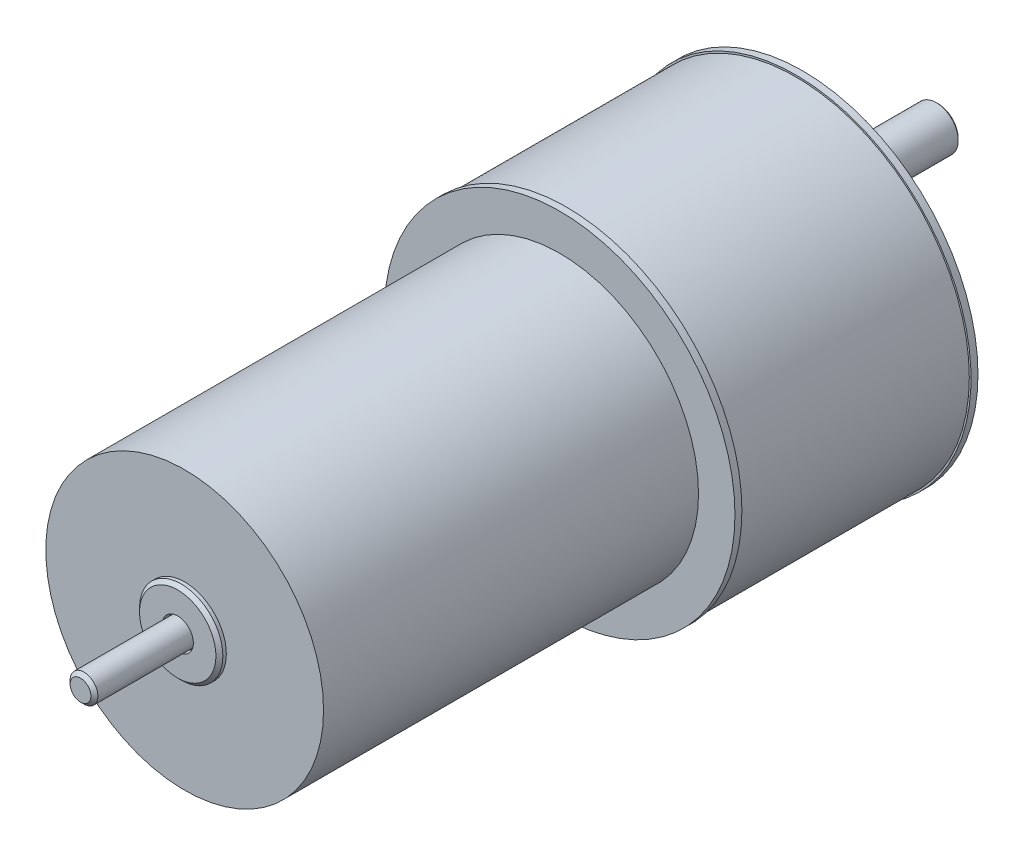
ISO-10303-21;
HEADER;
FILE_DESCRIPTION(('STEP AP214'),'2;1');
FILE_NAME('part.step','',(''),(''),'','','');
FILE_SCHEMA(('AUTOMOTIVE_DESIGN { 1 0 10303 214 1 1 1 1 }'));
ENDSEC;
DATA;
#1=APPLICATION_CONTEXT('core data for automotive mechanical design processes');
#2=APPLICATION_PROTOCOL_DEFINITION('international standard','automotive_design',2000,#1);
#3=PRODUCT_CONTEXT('',#1,'mechanical');
#4=PRODUCT('Part','Part','',(#3));
#5=PRODUCT_RELATED_PRODUCT_CATEGORY('part','',(#4));
#6=PRODUCT_DEFINITION_FORMATION('','',#4);
#7=PRODUCT_DEFINITION_CONTEXT('part definition',#1,'design');
#8=PRODUCT_DEFINITION('design','',#6,#7);
#9=PRODUCT_DEFINITION_SHAPE('','',#8);
#10=(LENGTH_UNIT() NAMED_UNIT(*) SI_UNIT(.MILLI.,.METRE.));
#11=(NAMED_UNIT(*) PLANE_ANGLE_UNIT() SI_UNIT($,.RADIAN.));
#12=(NAMED_UNIT(*) SI_UNIT($,.STERADIAN.) SOLID_ANGLE_UNIT());
#13=UNCERTAINTY_MEASURE_WITH_UNIT(LENGTH_MEASURE(1.E-05),#10,'distance_accuracy_value','');
#14=(GEOMETRIC_REPRESENTATION_CONTEXT(3) GLOBAL_UNCERTAINTY_ASSIGNED_CONTEXT((#13)) GLOBAL_UNIT_ASSIGNED_CONTEXT((#10,
#11,#12)) REPRESENTATION_CONTEXT('',''));
#15=CARTESIAN_POINT('',(0.,0.,0.));
#16=DIRECTION('',(0.,0.,1.));
#17=DIRECTION('',(1.,0.,0.));
#18=AXIS2_PLACEMENT_3D('',#15,#16,#17);
#19=CARTESIAN_POINT('',(0.,0.,35.));
#20=DIRECTION('',(0.,0.,-1.));
#21=DIRECTION('',(-1.,0.,0.));
#22=AXIS2_PLACEMENT_3D('',#19,#20,#21);
#23=CYLINDRICAL_SURFACE('',#22,25.25);
#24=CARTESIAN_POINT('',(0.,0.,34.));
#25=DIRECTION('',(0.,0.,1.));
#26=DIRECTION('',(1.,0.,0.));
#27=AXIS2_PLACEMENT_3D('',#24,#25,#26);
#28=CIRCLE('',#27,25.25);
#29=CARTESIAN_POINT('',(25.25,0.,34.));
#30=VERTEX_POINT('',#29);
#31=EDGE_CURVE('E40',#30,#30,#28,.T.);
#32=ORIENTED_EDGE('',*,*,#31,.T.);
#33=EDGE_LOOP('',(#32));
#34=FACE_BOUND('',#33,.T.);
#35=CARTESIAN_POINT('',(0.,0.,35.));
#36=DIRECTION('',(0.,0.,1.));
#37=DIRECTION('',(1.,0.,0.));
#38=AXIS2_PLACEMENT_3D('',#35,#36,#37);
#39=CIRCLE('',#38,25.25);
#40=CARTESIAN_POINT('',(25.25,0.,35.));
#41=VERTEX_POINT('',#40);
#42=EDGE_CURVE('E85',#41,#41,#39,.T.);
#43=ORIENTED_EDGE('',*,*,#42,.F.);
#44=EDGE_LOOP('',(#43));
#45=FACE_BOUND('',#44,.T.);
#46=ADVANCED_FACE('F36',(#34,#45),#23,.T.);
#47=CARTESIAN_POINT('',(0.,0.,89.));
#48=DIRECTION('',(0.,0.,1.));
#49=DIRECTION('',(1.,0.,0.));
#50=AXIS2_PLACEMENT_3D('',#47,#48,#49);
#51=PLANE('',#50);
#52=CARTESIAN_POINT('',(0.,0.,89.));
#53=DIRECTION('',(0.,0.,1.));
#54=DIRECTION('',(1.,0.,0.));
#55=AXIS2_PLACEMENT_3D('',#52,#53,#54);
#56=CIRCLE('',#55,20.);
#57=CARTESIAN_POINT('',(20.,0.,89.));
#58=VERTEX_POINT('',#57);
#59=EDGE_CURVE('E79',#58,#58,#56,.T.);
#60=ORIENTED_EDGE('',*,*,#59,.T.);
#61=EDGE_LOOP('',(#60));
#62=FACE_BOUND('',#61,.T.);
#63=CARTESIAN_POINT('',(0.,0.,89.));
#64=DIRECTION('',(0.,0.,1.));
#65=DIRECTION('',(1.,0.,0.));
#66=AXIS2_PLACEMENT_3D('',#63,#64,#65);
#67=CIRCLE('',#66,6.);
#68=CARTESIAN_POINT('',(6.,0.,89.));
#69=VERTEX_POINT('',#68);
#70=EDGE_CURVE('E126',#69,#69,#67,.T.);
#71=ORIENTED_EDGE('',*,*,#70,.F.);
#72=EDGE_LOOP('',(#71));
#73=FACE_BOUND('',#72,.T.);
#74=ADVANCED_FACE('F150',(#62,#73),#51,.T.);
#75=CARTESIAN_POINT('',(0.,0.,35.));
#76=DIRECTION('',(0.,0.,1.));
#77=DIRECTION('',(1.,0.,0.));
#78=AXIS2_PLACEMENT_3D('',#75,#76,#77);
#79=PLANE('',#78);
#80=ORIENTED_EDGE('',*,*,#42,.T.);
#81=EDGE_LOOP('',(#80));
#82=FACE_BOUND('',#81,.T.);
#83=CARTESIAN_POINT('',(0.,0.,35.));
#84=DIRECTION('',(0.,0.,1.));
#85=DIRECTION('',(1.,0.,0.));
#86=AXIS2_PLACEMENT_3D('',#83,#84,#85);
#87=CIRCLE('',#86,20.);
#88=CARTESIAN_POINT('',(20.,0.,35.));
#89=VERTEX_POINT('',#88);
#90=EDGE_CURVE('E78',#89,#89,#87,.T.);
#91=ORIENTED_EDGE('',*,*,#90,.F.);
#92=EDGE_LOOP('',(#91));
#93=FACE_BOUND('',#92,.T.);
#94=ADVANCED_FACE('F157',(#82,#93),#79,.T.);
#95=CARTESIAN_POINT('',(0.,0.,89.));
#96=DIRECTION('',(0.,0.,-1.));
#97=DIRECTION('',(-1.,0.,0.));
#98=AXIS2_PLACEMENT_3D('',#95,#96,#97);
#99=CYLINDRICAL_SURFACE('',#98,20.);
#100=ORIENTED_EDGE('',*,*,#59,.F.);
#101=EDGE_LOOP('',(#100));
#102=FACE_BOUND('',#101,.T.);
#103=ORIENTED_EDGE('',*,*,#90,.T.);
#104=EDGE_LOOP('',(#103));
#105=FACE_BOUND('',#104,.T.);
#106=ADVANCED_FACE('F190',(#102,#105),#99,.T.);
#107=CARTESIAN_POINT('',(0.,0.,90.));
#108=DIRECTION('',(0.,0.,1.));
#109=DIRECTION('',(1.,0.,0.));
#110=AXIS2_PLACEMENT_3D('',#107,#108,#109);
#111=PLANE('',#110);
#112=CARTESIAN_POINT('',(0.,0.,90.));
#113=DIRECTION('',(0.,0.,1.));
#114=DIRECTION('',(1.,0.,0.));
#115=AXIS2_PLACEMENT_3D('',#112,#113,#114);
#116=CIRCLE('',#115,5.50000000000002);
#117=CARTESIAN_POINT('',(5.50000000000002,0.,90.));
#118=VERTEX_POINT('',#117);
#119=EDGE_CURVE('E45',#118,#118,#116,.T.);
#120=ORIENTED_EDGE('',*,*,#119,.T.);
#121=EDGE_LOOP('',(#120));
#122=FACE_BOUND('',#121,.T.);
#123=CARTESIAN_POINT('',(0.,0.,90.));
#124=DIRECTION('',(0.,0.,1.));
#125=DIRECTION('',(1.,0.,0.));
#126=AXIS2_PLACEMENT_3D('',#123,#124,#125);
#127=CIRCLE('',#126,2.25);
#128=CARTESIAN_POINT('',(2.25,0.,90.));
#129=VERTEX_POINT('',#128);
#130=EDGE_CURVE('E115',#129,#129,#127,.T.);
#131=ORIENTED_EDGE('',*,*,#130,.F.);
#132=EDGE_LOOP('',(#131));
#133=FACE_BOUND('',#132,.T.);
#134=ADVANCED_FACE('F193',(#122,#133),#111,.T.);
#135=CARTESIAN_POINT('',(0.,0.,90.));
#136=DIRECTION('',(0.,0.,-1.));
#137=DIRECTION('',(-1.,0.,0.));
#138=AXIS2_PLACEMENT_3D('',#135,#136,#137);
#139=CYLINDRICAL_SURFACE('',#138,6.);
#140=CARTESIAN_POINT('',(0.,0.,89.5));
#141=DIRECTION('',(0.,0.,1.));
#142=DIRECTION('',(1.,0.,0.));
#143=AXIS2_PLACEMENT_3D('',#140,#141,#142);
#144=CIRCLE('',#143,6.);
#145=CARTESIAN_POINT('',(6.,0.,89.5));
#146=VERTEX_POINT('',#145);
#147=EDGE_CURVE('E11',#146,#146,#144,.F.);
#148=ORIENTED_EDGE('',*,*,#147,.T.);
#149=EDGE_LOOP('',(#148));
#150=FACE_BOUND('',#149,.T.);
#151=ORIENTED_EDGE('',*,*,#70,.T.);
#152=EDGE_LOOP('',(#151));
#153=FACE_BOUND('',#152,.T.);
#154=ADVANCED_FACE('F215',(#150,#153),#139,.T.);
#155=CARTESIAN_POINT('',(0.,0.,90.));
#156=DIRECTION('',(0.,0.,-1.));
#157=DIRECTION('',(-1.,0.,0.));
#158=AXIS2_PLACEMENT_3D('',#155,#156,#157);
#159=CYLINDRICAL_SURFACE('',#158,2.25);
#160=ORIENTED_EDGE('',*,*,#130,.T.);
#161=EDGE_LOOP('',(#160));
#162=FACE_BOUND('',#161,.T.);
#163=CARTESIAN_POINT('',(0.,0.,89.));
#164=DIRECTION('',(0.,0.,1.));
#165=DIRECTION('',(1.,0.,0.));
#166=AXIS2_PLACEMENT_3D('',#163,#164,#165);
#167=CIRCLE('',#166,2.25);
#168=CARTESIAN_POINT('',(2.25,0.,89.));
#169=VERTEX_POINT('',#168);
#170=EDGE_CURVE('E105',#169,#169,#167,.F.);
#171=ORIENTED_EDGE('',*,*,#170,.T.);
#172=EDGE_LOOP('',(#171));
#173=FACE_BOUND('',#172,.T.);
#174=ADVANCED_FACE('F224',(#162,#173),#159,.F.);
#175=CARTESIAN_POINT('',(0.,0.,104.));
#176=DIRECTION('',(0.,0.,1.));
#177=DIRECTION('',(1.,0.,0.));
#178=AXIS2_PLACEMENT_3D('',#175,#176,#177);
#179=PLANE('',#178);
#180=CARTESIAN_POINT('',(0.,0.,104.));
#181=DIRECTION('',(0.,0.,1.));
#182=DIRECTION('',(1.,0.,0.));
#183=AXIS2_PLACEMENT_3D('',#180,#181,#182);
#184=CIRCLE('',#183,1.49999999999997);
#185=CARTESIAN_POINT('',(1.49999999999997,0.,104.));
#186=VERTEX_POINT('',#185);
#187=EDGE_CURVE('E99',#186,#186,#184,.T.);
#188=ORIENTED_EDGE('',*,*,#187,.T.);
#189=EDGE_LOOP('',(#188));
#190=FACE_BOUND('',#189,.T.);
#191=ADVANCED_FACE('F233',(#190),#179,.T.);
#192=CARTESIAN_POINT('',(0.,0.,104.));
#193=DIRECTION('',(0.,0.,-1.));
#194=DIRECTION('',(-1.,0.,0.));
#195=AXIS2_PLACEMENT_3D('',#192,#193,#194);
#196=CONICAL_SURFACE('',#195,1.49999999999997,0.78539816339746);
#197=CARTESIAN_POINT('',(0.,0.,103.5));
#198=DIRECTION('',(0.,0.,1.));
#199=DIRECTION('',(1.,0.,0.));
#200=AXIS2_PLACEMENT_3D('',#197,#198,#199);
#201=CIRCLE('',#200,2.);
#202=CARTESIAN_POINT('',(2.,0.,103.5));
#203=VERTEX_POINT('',#202);
#204=EDGE_CURVE('E102',#203,#203,#201,.F.);
#205=ORIENTED_EDGE('',*,*,#204,.F.);
#206=EDGE_LOOP('',(#205));
#207=FACE_BOUND('',#206,.T.);
#208=ORIENTED_EDGE('',*,*,#187,.F.);
#209=EDGE_LOOP('',(#208));
#210=FACE_BOUND('',#209,.T.);
#211=ADVANCED_FACE('F241',(#207,#210),#196,.T.);
#212=CARTESIAN_POINT('',(0.,0.,104.));
#213=DIRECTION('',(0.,0.,-1.));
#214=DIRECTION('',(-1.,0.,0.));
#215=AXIS2_PLACEMENT_3D('',#212,#213,#214);
#216=CYLINDRICAL_SURFACE('',#215,2.);
#217=ORIENTED_EDGE('',*,*,#204,.T.);
#218=EDGE_LOOP('',(#217));
#219=FACE_BOUND('',#218,.T.);
#220=CARTESIAN_POINT('',(0.,0.,89.));
#221=DIRECTION('',(0.,0.,1.));
#222=DIRECTION('',(1.,0.,0.));
#223=AXIS2_PLACEMENT_3D('',#220,#221,#222);
#224=CIRCLE('',#223,2.);
#225=CARTESIAN_POINT('',(2.,0.,89.));
#226=VERTEX_POINT('',#225);
#227=EDGE_CURVE('E129',#226,#226,#224,.T.);
#228=ORIENTED_EDGE('',*,*,#227,.T.);
#229=EDGE_LOOP('',(#228));
#230=FACE_BOUND('',#229,.T.);
#231=ADVANCED_FACE('F188',(#219,#230),#216,.T.);
#232=ORIENTED_EDGE('',*,*,#170,.F.);
#233=EDGE_LOOP('',(#232));
#234=FACE_BOUND('',#233,.T.);
#235=ORIENTED_EDGE('',*,*,#227,.F.);
#236=EDGE_LOOP('',(#235));
#237=FACE_BOUND('',#236,.T.);
#238=ADVANCED_FACE('F160',(#234,#237),#51,.T.);
#239=CARTESIAN_POINT('',(0.,0.,90.));
#240=DIRECTION('',(0.,0.,-1.));
#241=DIRECTION('',(-1.,0.,0.));
#242=AXIS2_PLACEMENT_3D('',#239,#240,#241);
#243=CONICAL_SURFACE('',#242,5.50000000000002,0.785398163397444);
#244=ORIENTED_EDGE('',*,*,#147,.F.);
#245=EDGE_LOOP('',(#244));
#246=FACE_BOUND('',#245,.T.);
#247=ORIENTED_EDGE('',*,*,#119,.F.);
#248=EDGE_LOOP('',(#247));
#249=FACE_BOUND('',#248,.T.);
#250=ADVANCED_FACE('F38',(#246,#249),#243,.T.);
#251=CARTESIAN_POINT('',(0.,40.5404466934338,34.));
#252=DIRECTION('',(0.,0.,1.));
#253=DIRECTION('',(1.,0.,0.));
#254=AXIS2_PLACEMENT_3D('',#251,#252,#253);
#255=PLANE('',#254);
#256=CARTESIAN_POINT('',(0.,0.,34.));
#257=DIRECTION('',(0.,0.,-1.));
#258=DIRECTION('',(-1.,0.,0.));
#259=AXIS2_PLACEMENT_3D('',#256,#257,#258);
#260=CIRCLE('',#259,25.);
#261=CARTESIAN_POINT('',(-25.,0.,34.));
#262=VERTEX_POINT('',#261);
#263=EDGE_CURVE('E117',#262,#262,#260,.T.);
#264=ORIENTED_EDGE('',*,*,#263,.F.);
#265=EDGE_LOOP('',(#264));
#266=FACE_BOUND('',#265,.T.);
#267=ORIENTED_EDGE('',*,*,#31,.F.);
#268=EDGE_LOOP('',(#267));
#269=FACE_BOUND('',#268,.T.);
#270=ADVANCED_FACE('F265',(#266,#269),#255,.F.);
#271=CARTESIAN_POINT('',(0.,40.5404466934338,0.999999999999988));
#272=DIRECTION('',(0.,0.,-1.));
#273=DIRECTION('',(-1.,0.,0.));
#274=AXIS2_PLACEMENT_3D('',#271,#272,#273);
#275=PLANE('',#274);
#276=CARTESIAN_POINT('',(0.,0.,0.999999999999987));
#277=DIRECTION('',(0.,0.,-1.));
#278=DIRECTION('',(-1.,0.,0.));
#279=AXIS2_PLACEMENT_3D('',#276,#277,#278);
#280=CIRCLE('',#279,25.);
#281=CARTESIAN_POINT('',(-25.,0.,0.999999999999987));
#282=VERTEX_POINT('',#281);
#283=EDGE_CURVE('E111',#282,#282,#280,.T.);
#284=ORIENTED_EDGE('',*,*,#283,.T.);
#285=EDGE_LOOP('',(#284));
#286=FACE_BOUND('',#285,.T.);
#287=CARTESIAN_POINT('',(0.,0.,0.999999999999987));
#288=DIRECTION('',(0.,0.,-1.));
#289=DIRECTION('',(-1.,0.,0.));
#290=AXIS2_PLACEMENT_3D('',#287,#288,#289);
#291=CIRCLE('',#290,25.25);
#292=CARTESIAN_POINT('',(-25.25,0.,0.999999999999987));
#293=VERTEX_POINT('',#292);
#294=EDGE_CURVE('E109',#293,#293,#291,.T.);
#295=ORIENTED_EDGE('',*,*,#294,.F.);
#296=EDGE_LOOP('',(#295));
#297=FACE_BOUND('',#296,.T.);
#298=ADVANCED_FACE('F272',(#286,#297),#275,.F.);
#299=CARTESIAN_POINT('',(0.,0.,0.));
#300=DIRECTION('',(0.,0.,-1.));
#301=DIRECTION('',(-1.,0.,0.));
#302=AXIS2_PLACEMENT_3D('',#299,#300,#301);
#303=CYLINDRICAL_SURFACE('',#302,25.);
#304=ORIENTED_EDGE('',*,*,#283,.F.);
#305=EDGE_LOOP('',(#304));
#306=FACE_BOUND('',#305,.T.);
#307=ORIENTED_EDGE('',*,*,#263,.T.);
#308=EDGE_LOOP('',(#307));
#309=FACE_BOUND('',#308,.T.);
#310=ADVANCED_FACE('F280',(#306,#309),#303,.T.);
#311=CARTESIAN_POINT('',(0.,8.5,-19.5));
#312=DIRECTION('',(0.,0.,-1.));
#313=DIRECTION('',(-1.,0.,0.));
#314=AXIS2_PLACEMENT_3D('',#311,#312,#313);
#315=PLANE('',#314);
#316=CARTESIAN_POINT('',(0.,8.5,-19.5));
#317=DIRECTION('',(0.,0.,-1.));
#318=DIRECTION('',(-1.,0.,0.));
#319=AXIS2_PLACEMENT_3D('',#316,#317,#318);
#320=CIRCLE('',#319,2.89999999999999);
#321=CARTESIAN_POINT('',(-2.89999999999999,8.5,-19.5));
#322=VERTEX_POINT('',#321);
#323=EDGE_CURVE('E93',#322,#322,#320,.T.);
#324=ORIENTED_EDGE('',*,*,#323,.T.);
#325=EDGE_LOOP('',(#324));
#326=FACE_BOUND('',#325,.T.);
#327=ADVANCED_FACE('F287',(#326),#315,.T.);
#328=CARTESIAN_POINT('',(0.,8.5,-19.5));
#329=DIRECTION('',(0.,0.,1.));
#330=DIRECTION('',(1.,0.,0.));
#331=AXIS2_PLACEMENT_3D('',#328,#329,#330);
#332=CONICAL_SURFACE('',#331,2.89999999999999,0.785398163397456);
#333=CARTESIAN_POINT('',(0.,8.5,-19.25));
#334=DIRECTION('',(0.,0.,-1.));
#335=DIRECTION('',(-1.,0.,0.));
#336=AXIS2_PLACEMENT_3D('',#333,#334,#335);
#337=CIRCLE('',#336,3.15);
#338=CARTESIAN_POINT('',(-3.15,8.5,-19.25));
#339=VERTEX_POINT('',#338);
#340=EDGE_CURVE('E96',#339,#339,#337,.F.);
#341=ORIENTED_EDGE('',*,*,#340,.F.);
#342=EDGE_LOOP('',(#341));
#343=FACE_BOUND('',#342,.T.);
#344=ORIENTED_EDGE('',*,*,#323,.F.);
#345=EDGE_LOOP('',(#344));
#346=FACE_BOUND('',#345,.T.);
#347=ADVANCED_FACE('F145',(#343,#346),#332,.T.);
#348=CARTESIAN_POINT('',(0.,8.5,-19.5));
#349=DIRECTION('',(0.,0.,1.));
#350=DIRECTION('',(1.,0.,0.));
#351=AXIS2_PLACEMENT_3D('',#348,#349,#350);
#352=CYLINDRICAL_SURFACE('',#351,3.15);
#353=ORIENTED_EDGE('',*,*,#340,.T.);
#354=EDGE_LOOP('',(#353));
#355=FACE_BOUND('',#354,.T.);
#356=CARTESIAN_POINT('',(0.,8.5,-1.5));
#357=DIRECTION('',(0.,0.,-1.));
#358=DIRECTION('',(-1.,0.,0.));
#359=AXIS2_PLACEMENT_3D('',#356,#357,#358);
#360=CIRCLE('',#359,3.15);
#361=CARTESIAN_POINT('',(-3.15,8.5,-1.5));
#362=VERTEX_POINT('',#361);
#363=EDGE_CURVE('E69',#362,#362,#360,.T.);
#364=ORIENTED_EDGE('',*,*,#363,.T.);
#365=EDGE_LOOP('',(#364));
#366=FACE_BOUND('',#365,.T.);
#367=ADVANCED_FACE('F134',(#355,#366),#352,.T.);
#368=CARTESIAN_POINT('',(0.,0.,-1.5));
#369=DIRECTION('',(0.,0.,-1.));
#370=DIRECTION('',(-1.,0.,0.));
#371=AXIS2_PLACEMENT_3D('',#368,#369,#370);
#372=PLANE('',#371);
#373=CARTESIAN_POINT('',(0.,0.,-1.5));
#374=DIRECTION('',(0.,0.,-1.));
#375=DIRECTION('',(-1.,0.,0.));
#376=AXIS2_PLACEMENT_3D('',#373,#374,#375);
#377=CIRCLE('',#376,14.25);
#378=CARTESIAN_POINT('',(-14.25,0.,-1.5));
#379=VERTEX_POINT('',#378);
#380=EDGE_CURVE('E75',#379,#379,#377,.T.);
#381=ORIENTED_EDGE('',*,*,#380,.T.);
#382=EDGE_LOOP('',(#381));
#383=FACE_BOUND('',#382,.T.);
#384=ORIENTED_EDGE('',*,*,#363,.F.);
#385=EDGE_LOOP('',(#384));
#386=FACE_BOUND('',#385,.T.);
#387=ADVANCED_FACE('F136',(#383,#386),#372,.T.);
#388=CARTESIAN_POINT('',(-19.,0.,11.5));
#389=DIRECTION('',(0.,0.,-1.));
#390=DIRECTION('',(-1.,0.,0.));
#391=AXIS2_PLACEMENT_3D('',#388,#389,#390);
#392=CONICAL_SURFACE('',#391,1.65,1.02974425867665);
#393=CARTESIAN_POINT('',(-19.,0.,12.4914200213955));
#394=VERTEX_POINT('',#393);
#395=VERTEX_LOOP('',#394);
#396=FACE_BOUND('',#395,.T.);
#397=CARTESIAN_POINT('',(-19.,0.,11.5));
#398=DIRECTION('',(0.,0.,-1.));
#399=DIRECTION('',(-1.,0.,0.));
#400=AXIS2_PLACEMENT_3D('',#397,#398,#399);
#401=CIRCLE('',#400,1.65);
#402=CARTESIAN_POINT('',(-20.65,0.,11.5));
#403=VERTEX_POINT('',#402);
#404=EDGE_CURVE('E66',#403,#403,#401,.T.);
#405=ORIENTED_EDGE('',*,*,#404,.T.);
#406=EDGE_LOOP('',(#405));
#407=FACE_BOUND('',#406,.T.);
#408=ADVANCED_FACE('F56',(#396,#407),#392,.F.);
#409=CARTESIAN_POINT('',(19.,0.,11.5));
#410=DIRECTION('',(0.,0.,-1.));
#411=DIRECTION('',(-1.,0.,0.));
#412=AXIS2_PLACEMENT_3D('',#409,#410,#411);
#413=CONICAL_SURFACE('',#412,1.65,1.02974425867665);
#414=CARTESIAN_POINT('',(19.,0.,12.4914200213955));
#415=VERTEX_POINT('',#414);
#416=VERTEX_LOOP('',#415);
#417=FACE_BOUND('',#416,.T.);
#418=CARTESIAN_POINT('',(19.,0.,11.5));
#419=DIRECTION('',(0.,0.,-1.));
#420=DIRECTION('',(-1.,0.,0.));
#421=AXIS2_PLACEMENT_3D('',#418,#419,#420);
#422=CIRCLE('',#421,1.65);
#423=CARTESIAN_POINT('',(17.35,0.,11.5));
#424=VERTEX_POINT('',#423);
#425=EDGE_CURVE('E60',#424,#424,#422,.T.);
#426=ORIENTED_EDGE('',*,*,#425,.T.);
#427=EDGE_LOOP('',(#426));
#428=FACE_BOUND('',#427,.T.);
#429=ADVANCED_FACE('F52',(#417,#428),#413,.F.);
#430=CARTESIAN_POINT('',(0.,0.,-1.5));
#431=DIRECTION('',(0.,0.,1.));
#432=DIRECTION('',(1.,0.,0.));
#433=AXIS2_PLACEMENT_3D('',#430,#431,#432);
#434=CYLINDRICAL_SURFACE('',#433,14.25);
#435=ORIENTED_EDGE('',*,*,#380,.F.);
#436=EDGE_LOOP('',(#435));
#437=FACE_BOUND('',#436,.T.);
#438=CARTESIAN_POINT('',(0.,0.,0.));
#439=DIRECTION('',(0.,0.,1.));
#440=DIRECTION('',(1.,0.,0.));
#441=AXIS2_PLACEMENT_3D('',#438,#439,#440);
#442=CIRCLE('',#441,14.25);
#443=CARTESIAN_POINT('',(14.25,0.,0.));
#444=VERTEX_POINT('',#443);
#445=EDGE_CURVE('E88',#444,#444,#442,.F.);
#446=ORIENTED_EDGE('',*,*,#445,.T.);
#447=EDGE_LOOP('',(#446));
#448=FACE_BOUND('',#447,.T.);
#449=ADVANCED_FACE('F55',(#437,#448),#434,.T.);
#450=CARTESIAN_POINT('',(-19.,0.,0.));
#451=DIRECTION('',(0.,0.,-1.));
#452=DIRECTION('',(-1.,0.,0.));
#453=AXIS2_PLACEMENT_3D('',#450,#451,#452);
#454=CYLINDRICAL_SURFACE('',#453,1.65);
#455=ORIENTED_EDGE('',*,*,#404,.F.);
#456=EDGE_LOOP('',(#455));
#457=FACE_BOUND('',#456,.T.);
#458=CARTESIAN_POINT('',(-19.,0.,0.));
#459=DIRECTION('',(0.,0.,-1.));
#460=DIRECTION('',(-1.,0.,0.));
#461=AXIS2_PLACEMENT_3D('',#458,#459,#460);
#462=CIRCLE('',#461,1.65);
#463=CARTESIAN_POINT('',(-20.65,0.,0.));
#464=VERTEX_POINT('',#463);
#465=EDGE_CURVE('E62',#464,#464,#462,.T.);
#466=ORIENTED_EDGE('',*,*,#465,.T.);
#467=EDGE_LOOP('',(#466));
#468=FACE_BOUND('',#467,.T.);
#469=ADVANCED_FACE('F178',(#457,#468),#454,.F.);
#470=CARTESIAN_POINT('',(19.,0.,0.));
#471=DIRECTION('',(0.,0.,-1.));
#472=DIRECTION('',(-1.,0.,0.));
#473=AXIS2_PLACEMENT_3D('',#470,#471,#472);
#474=CYLINDRICAL_SURFACE('',#473,1.65);
#475=ORIENTED_EDGE('',*,*,#425,.F.);
#476=EDGE_LOOP('',(#475));
#477=FACE_BOUND('',#476,.T.);
#478=CARTESIAN_POINT('',(19.,0.,0.));
#479=DIRECTION('',(0.,0.,-1.));
#480=DIRECTION('',(-1.,0.,0.));
#481=AXIS2_PLACEMENT_3D('',#478,#479,#480);
#482=CIRCLE('',#481,1.65);
#483=CARTESIAN_POINT('',(17.35,0.,0.));
#484=VERTEX_POINT('',#483);
#485=EDGE_CURVE('E63',#484,#484,#482,.T.);
#486=ORIENTED_EDGE('',*,*,#485,.T.);
#487=EDGE_LOOP('',(#486));
#488=FACE_BOUND('',#487,.T.);
#489=ADVANCED_FACE('F169',(#477,#488),#474,.F.);
#490=CARTESIAN_POINT('',(0.,0.,0.));
#491=DIRECTION('',(0.,0.,1.));
#492=DIRECTION('',(1.,0.,0.));
#493=AXIS2_PLACEMENT_3D('',#490,#491,#492);
#494=PLANE('',#493);
#495=ORIENTED_EDGE('',*,*,#485,.F.);
#496=EDGE_LOOP('',(#495));
#497=FACE_BOUND('',#496,.T.);
#498=ORIENTED_EDGE('',*,*,#465,.F.);
#499=EDGE_LOOP('',(#498));
#500=FACE_BOUND('',#499,.T.);
#501=CARTESIAN_POINT('',(0.,0.,0.));
#502=DIRECTION('',(0.,0.,1.));
#503=DIRECTION('',(1.,0.,0.));
#504=AXIS2_PLACEMENT_3D('',#501,#502,#503);
#505=CIRCLE('',#504,25.25);
#506=CARTESIAN_POINT('',(25.25,0.,0.));
#507=VERTEX_POINT('',#506);
#508=EDGE_CURVE('E82',#507,#507,#505,.T.);
#509=ORIENTED_EDGE('',*,*,#508,.F.);
#510=EDGE_LOOP('',(#509));
#511=FACE_BOUND('',#510,.T.);
#512=ORIENTED_EDGE('',*,*,#445,.F.);
#513=EDGE_LOOP('',(#512));
#514=FACE_BOUND('',#513,.T.);
#515=ADVANCED_FACE('F165',(#497,#500,#511,#514),#494,.F.);
#516=ORIENTED_EDGE('',*,*,#294,.T.);
#517=EDGE_LOOP('',(#516));
#518=FACE_BOUND('',#517,.T.);
#519=ORIENTED_EDGE('',*,*,#508,.T.);
#520=EDGE_LOOP('',(#519));
#521=FACE_BOUND('',#520,.T.);
#522=ADVANCED_FACE('F153',(#518,#521),#23,.T.);
#523=CLOSED_SHELL('',(#46,#74,#94,#106,#134,#154,#174,#191,#211,#231,#238,#250,#270,#298,#310,
#327,#347,#367,#387,#408,#429,#449,#469,#489,#515,#522));
#524=MANIFOLD_SOLID_BREP('B2',#523);
#525=ADVANCED_BREP_SHAPE_REPRESENTATION('',(#18,#524),#14);
#526=SHAPE_DEFINITION_REPRESENTATION(#9,#525);
ENDSEC;
END-ISO-10303-21;
